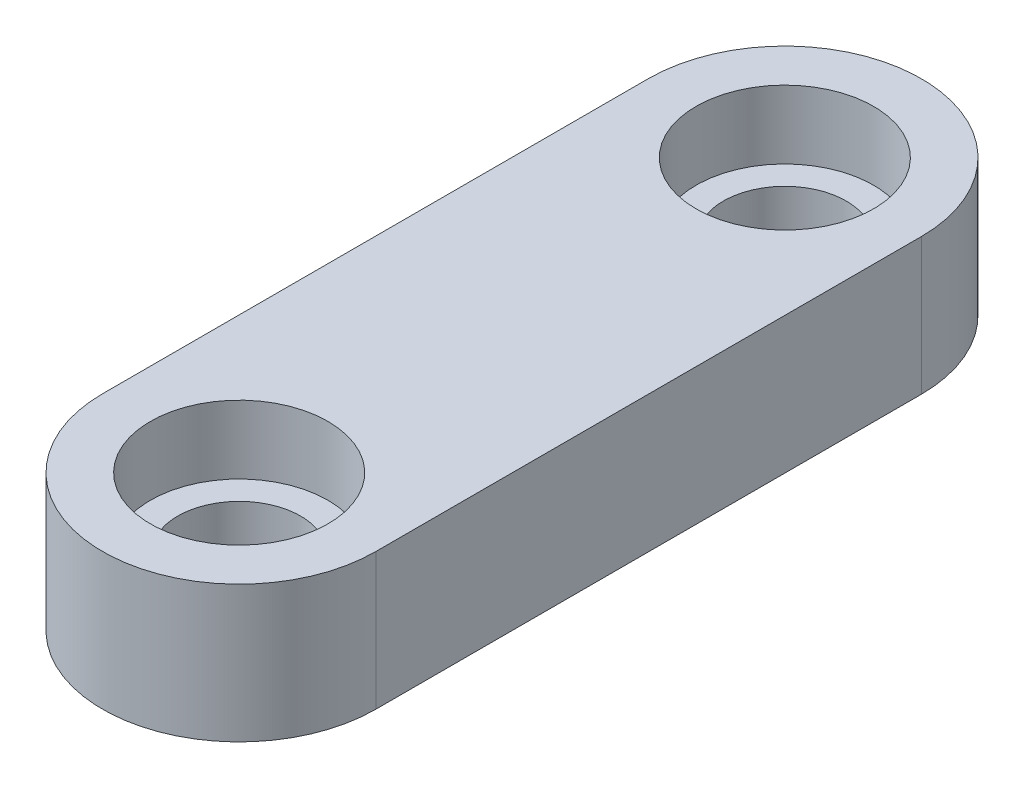
ISO-10303-21;
HEADER;
FILE_DESCRIPTION(('STEP AP214'),'2;1');
FILE_NAME('part.step','',(''),(''),'','','');
FILE_SCHEMA(('AUTOMOTIVE_DESIGN { 1 0 10303 214 1 1 1 1 }'));
ENDSEC;
DATA;
#1=APPLICATION_CONTEXT('core data for automotive mechanical design processes');
#2=APPLICATION_PROTOCOL_DEFINITION('international standard','automotive_design',2000,#1);
#3=PRODUCT_CONTEXT('',#1,'mechanical');
#4=PRODUCT('Part','Part','',(#3));
#5=PRODUCT_RELATED_PRODUCT_CATEGORY('part','',(#4));
#6=PRODUCT_DEFINITION_FORMATION('','',#4);
#7=PRODUCT_DEFINITION_CONTEXT('part definition',#1,'design');
#8=PRODUCT_DEFINITION('design','',#6,#7);
#9=PRODUCT_DEFINITION_SHAPE('','',#8);
#10=(LENGTH_UNIT() NAMED_UNIT(*) SI_UNIT(.MILLI.,.METRE.));
#11=(NAMED_UNIT(*) PLANE_ANGLE_UNIT() SI_UNIT($,.RADIAN.));
#12=(NAMED_UNIT(*) SI_UNIT($,.STERADIAN.) SOLID_ANGLE_UNIT());
#13=UNCERTAINTY_MEASURE_WITH_UNIT(LENGTH_MEASURE(1.E-05),#10,'distance_accuracy_value','');
#14=(GEOMETRIC_REPRESENTATION_CONTEXT(3) GLOBAL_UNCERTAINTY_ASSIGNED_CONTEXT((#13)) GLOBAL_UNIT_ASSIGNED_CONTEXT((#10,
#11,#12)) REPRESENTATION_CONTEXT('',''));
#15=CARTESIAN_POINT('',(0.,0.,0.));
#16=DIRECTION('',(0.,0.,1.));
#17=DIRECTION('',(1.,0.,0.));
#18=AXIS2_PLACEMENT_3D('',#15,#16,#17);
#19=CARTESIAN_POINT('',(-10.,-5.,59.9396097380543));
#20=DIRECTION('',(1.,0.,0.));
#21=DIRECTION('',(0.,0.,-1.));
#22=AXIS2_PLACEMENT_3D('',#19,#20,#21);
#23=PLANE('',#22);
#24=CARTESIAN_POINT('',(-10.,-1.,23.68932285491));
#25=DIRECTION('',(1.,0.,0.));
#26=DIRECTION('',(0.,0.,-1.));
#27=AXIS2_PLACEMENT_3D('',#24,#25,#26);
#28=CIRCLE('',#27,1.25);
#29=CARTESIAN_POINT('',(-10.,-1.,22.43932285491));
#30=VERTEX_POINT('',#29);
#31=EDGE_CURVE('E209',#30,#30,#28,.T.);
#32=ORIENTED_EDGE('',*,*,#31,.T.);
#33=EDGE_LOOP('',(#32));
#34=FACE_BOUND('',#33,.T.);
#35=CARTESIAN_POINT('',(-10.,-1.,27.8059310864469));
#36=DIRECTION('',(1.,0.,0.));
#37=DIRECTION('',(0.,0.,-1.));
#38=AXIS2_PLACEMENT_3D('',#35,#36,#37);
#39=CIRCLE('',#38,1.25);
#40=CARTESIAN_POINT('',(-10.,-1.,26.5559310864469));
#41=VERTEX_POINT('',#40);
#42=EDGE_CURVE('E530',#41,#41,#39,.T.);
#43=ORIENTED_EDGE('',*,*,#42,.T.);
#44=EDGE_LOOP('',(#43));
#45=FACE_BOUND('',#44,.T.);
#46=DIRECTION('',(0.,1.,0.));
#47=VECTOR('',#46,1.);
#48=CARTESIAN_POINT('',(-10.,-5.,49.9396097380543));
#49=LINE('',#48,#47);
#50=CARTESIAN_POINT('',(-10.,-5.,49.9396097380543));
#51=VERTEX_POINT('',#50);
#52=CARTESIAN_POINT('',(-10.,5.,49.9396097380543));
#53=VERTEX_POINT('',#52);
#54=EDGE_CURVE('E299',#51,#53,#49,.T.);
#55=ORIENTED_EDGE('',*,*,#54,.T.);
#56=DIRECTION('',(0.,0.,-1.));
#57=VECTOR('',#56,1.);
#58=CARTESIAN_POINT('',(-10.,5.,59.9396097380543));
#59=LINE('',#58,#57);
#60=CARTESIAN_POINT('',(-10.,5.,10.));
#61=VERTEX_POINT('',#60);
#62=EDGE_CURVE('E84',#53,#61,#59,.T.);
#63=ORIENTED_EDGE('',*,*,#62,.T.);
#64=DIRECTION('',(0.,1.,0.));
#65=VECTOR('',#64,1.);
#66=CARTESIAN_POINT('',(-10.,-5.,10.));
#67=LINE('',#66,#65);
#68=CARTESIAN_POINT('',(-10.,-5.,10.));
#69=VERTEX_POINT('',#68);
#70=EDGE_CURVE('E326',#69,#61,#67,.T.);
#71=ORIENTED_EDGE('',*,*,#70,.F.);
#72=DIRECTION('',(0.,0.,-1.));
#73=VECTOR('',#72,1.);
#74=CARTESIAN_POINT('',(-10.,-5.,59.9396097380543));
#75=LINE('',#74,#73);
#76=CARTESIAN_POINT('',(-10.,-5.,29.7476269706785));
#77=VERTEX_POINT('',#76);
#78=EDGE_CURVE('E349',#77,#69,#75,.T.);
#79=ORIENTED_EDGE('',*,*,#78,.F.);
#80=DIRECTION('',(0.,1.,0.));
#81=VECTOR('',#80,1.);
#82=CARTESIAN_POINT('',(-10.,-10.,29.7476269706785));
#83=LINE('',#82,#81);
#84=CARTESIAN_POINT('',(-10.,-10.,29.7476269706785));
#85=VERTEX_POINT('',#84);
#86=EDGE_CURVE('E285',#85,#77,#83,.T.);
#87=ORIENTED_EDGE('',*,*,#86,.F.);
#88=DIRECTION('',(0.,0.,1.));
#89=VECTOR('',#88,1.);
#90=CARTESIAN_POINT('',(-10.,-10.,33.7738022007449));
#91=LINE('',#90,#89);
#92=CARTESIAN_POINT('',(-10.,-10.,33.7738022007449));
#93=VERTEX_POINT('',#92);
#94=EDGE_CURVE('E237',#85,#93,#91,.T.);
#95=ORIENTED_EDGE('',*,*,#94,.T.);
#96=DIRECTION('',(0.,1.,0.));
#97=VECTOR('',#96,1.);
#98=CARTESIAN_POINT('',(-10.,-10.,33.7738022007449));
#99=LINE('',#98,#97);
#100=CARTESIAN_POINT('',(-10.,-5.,33.7738022007449));
#101=VERTEX_POINT('',#100);
#102=EDGE_CURVE('E282',#93,#101,#99,.T.);
#103=ORIENTED_EDGE('',*,*,#102,.T.);
#104=EDGE_CURVE('E350',#51,#101,#75,.T.);
#105=ORIENTED_EDGE('',*,*,#104,.F.);
#106=EDGE_LOOP('',(#55,#63,#71,#79,#87,#95,#103,#105));
#107=FACE_BOUND('',#106,.T.);
#108=ADVANCED_FACE('F74',(#34,#45,#107),#23,.F.);
#109=CARTESIAN_POINT('',(-10.,5.,59.9396097380543));
#110=DIRECTION('',(0.,-1.,0.));
#111=DIRECTION('',(0.,0.,-1.));
#112=AXIS2_PLACEMENT_3D('',#109,#110,#111);
#113=PLANE('',#112);
#114=CARTESIAN_POINT('',(0.,5.,49.9396097380543));
#115=DIRECTION('',(0.,-1.,0.));
#116=DIRECTION('',(0.,0.,-1.));
#117=AXIS2_PLACEMENT_3D('',#114,#115,#116);
#118=CIRCLE('',#117,6.5);
#119=CARTESIAN_POINT('',(0.,5.,43.4396097380543));
#120=VERTEX_POINT('',#119);
#121=EDGE_CURVE('E309',#120,#120,#118,.T.);
#122=ORIENTED_EDGE('',*,*,#121,.T.);
#123=EDGE_LOOP('',(#122));
#124=FACE_BOUND('',#123,.T.);
#125=CARTESIAN_POINT('',(0.,5.,10.));
#126=DIRECTION('',(0.,1.,0.));
#127=DIRECTION('',(0.,0.,1.));
#128=AXIS2_PLACEMENT_3D('',#125,#126,#127);
#129=CIRCLE('',#128,6.5);
#130=CARTESIAN_POINT('',(0.,5.,16.5));
#131=VERTEX_POINT('',#130);
#132=EDGE_CURVE('E338',#131,#131,#129,.T.);
#133=ORIENTED_EDGE('',*,*,#132,.F.);
#134=EDGE_LOOP('',(#133));
#135=FACE_BOUND('',#134,.T.);
#136=CARTESIAN_POINT('',(0.,5.,49.9396097380543));
#137=DIRECTION('',(0.,-1.,0.));
#138=DIRECTION('',(0.,0.,-1.));
#139=AXIS2_PLACEMENT_3D('',#136,#137,#138);
#140=CIRCLE('',#139,10.);
#141=CARTESIAN_POINT('',(10.,5.,49.9396097380543));
#142=VERTEX_POINT('',#141);
#143=EDGE_CURVE('E294',#142,#53,#140,.T.);
#144=ORIENTED_EDGE('',*,*,#143,.F.);
#145=DIRECTION('',(0.,0.,-1.));
#146=VECTOR('',#145,1.);
#147=CARTESIAN_POINT('',(10.,5.,59.9396097380543));
#148=LINE('',#147,#146);
#149=CARTESIAN_POINT('',(10.,5.,10.));
#150=VERTEX_POINT('',#149);
#151=EDGE_CURVE('E12',#142,#150,#148,.T.);
#152=ORIENTED_EDGE('',*,*,#151,.T.);
#153=CARTESIAN_POINT('',(0.,5.,10.));
#154=DIRECTION('',(0.,1.,0.));
#155=DIRECTION('',(0.,0.,1.));
#156=AXIS2_PLACEMENT_3D('',#153,#154,#155);
#157=CIRCLE('',#156,10.);
#158=EDGE_CURVE('E321',#150,#61,#157,.T.);
#159=ORIENTED_EDGE('',*,*,#158,.T.);
#160=ORIENTED_EDGE('',*,*,#62,.F.);
#161=EDGE_LOOP('',(#144,#152,#159,#160));
#162=FACE_BOUND('',#161,.T.);
#163=ADVANCED_FACE('F374',(#124,#135,#162),#113,.F.);
#164=CARTESIAN_POINT('',(-10.,-5.,59.9396097380543));
#165=DIRECTION('',(0.,1.,0.));
#166=DIRECTION('',(0.,0.,1.));
#167=AXIS2_PLACEMENT_3D('',#164,#165,#166);
#168=PLANE('',#167);
#169=CARTESIAN_POINT('',(0.,-5.,49.9396097380543));
#170=DIRECTION('',(0.,1.,0.));
#171=DIRECTION('',(0.,0.,1.));
#172=AXIS2_PLACEMENT_3D('',#169,#170,#171);
#173=CIRCLE('',#172,4.5);
#174=CARTESIAN_POINT('',(0.,-5.,54.4396097380543));
#175=VERTEX_POINT('',#174);
#176=EDGE_CURVE('E305',#175,#175,#173,.F.);
#177=ORIENTED_EDGE('',*,*,#176,.F.);
#178=EDGE_LOOP('',(#177));
#179=FACE_BOUND('',#178,.T.);
#180=CARTESIAN_POINT('',(0.,-5.,10.));
#181=DIRECTION('',(0.,1.,0.));
#182=DIRECTION('',(0.,0.,1.));
#183=AXIS2_PLACEMENT_3D('',#180,#181,#182);
#184=CIRCLE('',#183,4.5);
#185=CARTESIAN_POINT('',(0.,-5.,14.5));
#186=VERTEX_POINT('',#185);
#187=EDGE_CURVE('E334',#186,#186,#184,.T.);
#188=ORIENTED_EDGE('',*,*,#187,.T.);
#189=EDGE_LOOP('',(#188));
#190=FACE_BOUND('',#189,.T.);
#191=DIRECTION('',(1.,0.,0.));
#192=VECTOR('',#191,1.);
#193=CARTESIAN_POINT('',(-7.,-5.,21.7476269706784));
#194=LINE('',#193,#192);
#195=CARTESIAN_POINT('',(-7.,-5.,21.7476269706784));
#196=VERTEX_POINT('',#195);
#197=CARTESIAN_POINT('',(-3.8915716590061,-5.,21.7476269706784));
#198=VERTEX_POINT('',#197);
#199=EDGE_CURVE('E206',#196,#198,#194,.T.);
#200=ORIENTED_EDGE('',*,*,#199,.F.);
#201=DIRECTION('',(0.,0.,-1.));
#202=VECTOR('',#201,1.);
#203=CARTESIAN_POINT('',(-7.,-5.,29.7476269706784));
#204=LINE('',#203,#202);
#205=CARTESIAN_POINT('',(-7.,-5.,29.7476269706784));
#206=VERTEX_POINT('',#205);
#207=EDGE_CURVE('E184',#206,#196,#204,.T.);
#208=ORIENTED_EDGE('',*,*,#207,.F.);
#209=DIRECTION('',(-1.,0.,0.));
#210=VECTOR('',#209,1.);
#211=CARTESIAN_POINT('',(0.,-5.,29.7476269706784));
#212=LINE('',#211,#210);
#213=EDGE_CURVE('E256',#206,#77,#212,.T.);
#214=ORIENTED_EDGE('',*,*,#213,.T.);
#215=ORIENTED_EDGE('',*,*,#78,.T.);
#216=CARTESIAN_POINT('',(0.,-5.,10.));
#217=DIRECTION('',(0.,1.,0.));
#218=DIRECTION('',(0.,0.,1.));
#219=AXIS2_PLACEMENT_3D('',#216,#217,#218);
#220=CIRCLE('',#219,10.);
#221=CARTESIAN_POINT('',(10.,-5.,10.));
#222=VERTEX_POINT('',#221);
#223=EDGE_CURVE('E322',#222,#69,#220,.T.);
#224=ORIENTED_EDGE('',*,*,#223,.F.);
#225=DIRECTION('',(0.,0.,-1.));
#226=VECTOR('',#225,1.);
#227=CARTESIAN_POINT('',(10.,-5.,59.9396097380543));
#228=LINE('',#227,#226);
#229=CARTESIAN_POINT('',(10.,-5.,49.9396097380543));
#230=VERTEX_POINT('',#229);
#231=EDGE_CURVE('E343',#230,#222,#228,.T.);
#232=ORIENTED_EDGE('',*,*,#231,.F.);
#233=CARTESIAN_POINT('',(0.,-5.,49.9396097380543));
#234=DIRECTION('',(0.,-1.,0.));
#235=DIRECTION('',(0.,0.,-1.));
#236=AXIS2_PLACEMENT_3D('',#233,#234,#235);
#237=CIRCLE('',#236,10.);
#238=EDGE_CURVE('E295',#230,#51,#237,.T.);
#239=ORIENTED_EDGE('',*,*,#238,.T.);
#240=ORIENTED_EDGE('',*,*,#104,.T.);
#241=DIRECTION('',(0.86602540378444,0.,0.499999999999998));
#242=VECTOR('',#241,1.);
#243=CARTESIAN_POINT('',(-3.74463441831306,-5.,37.3853392032113));
#244=LINE('',#243,#242);
#245=CARTESIAN_POINT('',(-3.74463441831306,-5.,37.3853392032113));
#246=VERTEX_POINT('',#245);
#247=EDGE_CURVE('E261',#101,#246,#244,.T.);
#248=ORIENTED_EDGE('',*,*,#247,.T.);
#249=DIRECTION('',(0.,0.,-1.));
#250=VECTOR('',#249,1.);
#251=CARTESIAN_POINT('',(-3.74463441831294,-5.,33.8403871371327));
#252=LINE('',#251,#250);
#253=CARTESIAN_POINT('',(-3.74463441831294,-5.,33.8403871371327));
#254=VERTEX_POINT('',#253);
#255=EDGE_CURVE('E265',#246,#254,#252,.T.);
#256=ORIENTED_EDGE('',*,*,#255,.T.);
#257=DIRECTION('',(1.,0.,0.));
#258=VECTOR('',#257,1.);
#259=CARTESIAN_POINT('',(-3.74463441831294,-5.,33.8403871371327));
#260=LINE('',#259,#258);
#261=CARTESIAN_POINT('',(0.,-5.,33.8403871371327));
#262=VERTEX_POINT('',#261);
#263=EDGE_CURVE('E233',#254,#262,#260,.T.);
#264=ORIENTED_EDGE('',*,*,#263,.T.);
#265=DIRECTION('',(0.,0.,-1.));
#266=VECTOR('',#265,1.);
#267=CARTESIAN_POINT('',(0.,-5.,29.7476269706784));
#268=LINE('',#267,#266);
#269=CARTESIAN_POINT('',(0.,-5.,29.7476269706784));
#270=VERTEX_POINT('',#269);
#271=EDGE_CURVE('E100',#262,#270,#268,.T.);
#272=ORIENTED_EDGE('',*,*,#271,.T.);
#273=CARTESIAN_POINT('',(-3.8915716590061,-5.,29.7476269706784));
#274=VERTEX_POINT('',#273);
#275=EDGE_CURVE('E257',#270,#274,#212,.T.);
#276=ORIENTED_EDGE('',*,*,#275,.T.);
#277=DIRECTION('',(0.,0.,1.));
#278=VECTOR('',#277,1.);
#279=CARTESIAN_POINT('',(-3.8915716590061,-5.,29.7476269706784));
#280=LINE('',#279,#278);
#281=EDGE_CURVE('E92',#198,#274,#280,.T.);
#282=ORIENTED_EDGE('',*,*,#281,.F.);
#283=EDGE_LOOP('',(#200,#208,#214,#215,#224,#232,#239,#240,#248,#256,#264,#272,#276,#282));
#284=FACE_BOUND('',#283,.T.);
#285=ADVANCED_FACE('F377',(#179,#190,#284),#168,.F.);
#286=CARTESIAN_POINT('',(10.,-5.,59.9396097380543));
#287=DIRECTION('',(-1.,0.,0.));
#288=DIRECTION('',(0.,0.,1.));
#289=AXIS2_PLACEMENT_3D('',#286,#287,#288);
#290=PLANE('',#289);
#291=ORIENTED_EDGE('',*,*,#151,.F.);
#292=DIRECTION('',(0.,1.,0.));
#293=VECTOR('',#292,1.);
#294=CARTESIAN_POINT('',(10.,-5.,49.9396097380543));
#295=LINE('',#294,#293);
#296=EDGE_CURVE('E275',#230,#142,#295,.T.);
#297=ORIENTED_EDGE('',*,*,#296,.F.);
#298=ORIENTED_EDGE('',*,*,#231,.T.);
#299=DIRECTION('',(0.,1.,0.));
#300=VECTOR('',#299,1.);
#301=CARTESIAN_POINT('',(10.,-5.,10.));
#302=LINE('',#301,#300);
#303=EDGE_CURVE('E314',#222,#150,#302,.T.);
#304=ORIENTED_EDGE('',*,*,#303,.T.);
#305=EDGE_LOOP('',(#291,#297,#298,#304));
#306=FACE_BOUND('',#305,.T.);
#307=ADVANCED_FACE('F76',(#306),#290,.F.);
#308=CARTESIAN_POINT('',(0.,0.,10.));
#309=DIRECTION('',(0.,1.,0.));
#310=DIRECTION('',(0.,0.,1.));
#311=AXIS2_PLACEMENT_3D('',#308,#309,#310);
#312=CYLINDRICAL_SURFACE('',#311,6.5);
#313=CARTESIAN_POINT('',(0.,0.,10.));
#314=DIRECTION('',(0.,1.,0.));
#315=DIRECTION('',(0.,0.,1.));
#316=AXIS2_PLACEMENT_3D('',#313,#314,#315);
#317=CIRCLE('',#316,6.5);
#318=CARTESIAN_POINT('',(0.,0.,16.5));
#319=VERTEX_POINT('',#318);
#320=EDGE_CURVE('E339',#319,#319,#317,.T.);
#321=ORIENTED_EDGE('',*,*,#320,.F.);
#322=EDGE_LOOP('',(#321));
#323=FACE_BOUND('',#322,.T.);
#324=ORIENTED_EDGE('',*,*,#132,.T.);
#325=EDGE_LOOP('',(#324));
#326=FACE_BOUND('',#325,.T.);
#327=ADVANCED_FACE('F365',(#323,#326),#312,.F.);
#328=CARTESIAN_POINT('',(0.,0.,10.));
#329=DIRECTION('',(0.,1.,0.));
#330=DIRECTION('',(0.,0.,1.));
#331=AXIS2_PLACEMENT_3D('',#328,#329,#330);
#332=PLANE('',#331);
#333=CARTESIAN_POINT('',(0.,0.,10.));
#334=DIRECTION('',(0.,1.,0.));
#335=DIRECTION('',(0.,0.,1.));
#336=AXIS2_PLACEMENT_3D('',#333,#334,#335);
#337=CIRCLE('',#336,4.5);
#338=CARTESIAN_POINT('',(0.,0.,14.5));
#339=VERTEX_POINT('',#338);
#340=EDGE_CURVE('E333',#339,#339,#337,.T.);
#341=ORIENTED_EDGE('',*,*,#340,.F.);
#342=EDGE_LOOP('',(#341));
#343=FACE_BOUND('',#342,.T.);
#344=ORIENTED_EDGE('',*,*,#320,.T.);
#345=EDGE_LOOP('',(#344));
#346=FACE_BOUND('',#345,.T.);
#347=ADVANCED_FACE('F362',(#343,#346),#332,.T.);
#348=CARTESIAN_POINT('',(0.,-15.,10.));
#349=DIRECTION('',(0.,1.,0.));
#350=DIRECTION('',(0.,0.,1.));
#351=AXIS2_PLACEMENT_3D('',#348,#349,#350);
#352=CYLINDRICAL_SURFACE('',#351,4.5);
#353=ORIENTED_EDGE('',*,*,#340,.T.);
#354=EDGE_LOOP('',(#353));
#355=FACE_BOUND('',#354,.T.);
#356=ORIENTED_EDGE('',*,*,#187,.F.);
#357=EDGE_LOOP('',(#356));
#358=FACE_BOUND('',#357,.T.);
#359=ADVANCED_FACE('F359',(#355,#358),#352,.F.);
#360=CARTESIAN_POINT('',(0.,-5.,10.));
#361=DIRECTION('',(0.,1.,0.));
#362=DIRECTION('',(0.,0.,1.));
#363=AXIS2_PLACEMENT_3D('',#360,#361,#362);
#364=CYLINDRICAL_SURFACE('',#363,10.);
#365=ORIENTED_EDGE('',*,*,#158,.F.);
#366=ORIENTED_EDGE('',*,*,#303,.F.);
#367=ORIENTED_EDGE('',*,*,#223,.T.);
#368=ORIENTED_EDGE('',*,*,#70,.T.);
#369=EDGE_LOOP('',(#365,#366,#367,#368));
#370=FACE_BOUND('',#369,.T.);
#371=ADVANCED_FACE('F390',(#370),#364,.T.);
#372=CARTESIAN_POINT('',(0.,0.,49.9396097380543));
#373=DIRECTION('',(0.,1.,0.));
#374=DIRECTION('',(0.,0.,1.));
#375=AXIS2_PLACEMENT_3D('',#372,#373,#374);
#376=CYLINDRICAL_SURFACE('',#375,6.5);
#377=CARTESIAN_POINT('',(0.,0.,49.9396097380543));
#378=DIRECTION('',(0.,-1.,0.));
#379=DIRECTION('',(0.,0.,-1.));
#380=AXIS2_PLACEMENT_3D('',#377,#378,#379);
#381=CIRCLE('',#380,6.5);
#382=CARTESIAN_POINT('',(0.,0.,43.4396097380543));
#383=VERTEX_POINT('',#382);
#384=EDGE_CURVE('E310',#383,#383,#381,.T.);
#385=ORIENTED_EDGE('',*,*,#384,.T.);
#386=EDGE_LOOP('',(#385));
#387=FACE_BOUND('',#386,.T.);
#388=ORIENTED_EDGE('',*,*,#121,.F.);
#389=EDGE_LOOP('',(#388));
#390=FACE_BOUND('',#389,.T.);
#391=ADVANCED_FACE('F448',(#387,#390),#376,.F.);
#392=CARTESIAN_POINT('',(0.,0.,49.9396097380543));
#393=DIRECTION('',(0.,1.,0.));
#394=DIRECTION('',(0.,0.,-1.));
#395=AXIS2_PLACEMENT_3D('',#392,#393,#394);
#396=PLANE('',#395);
#397=CARTESIAN_POINT('',(0.,0.,49.9396097380543));
#398=DIRECTION('',(0.,1.,0.));
#399=DIRECTION('',(0.,0.,1.));
#400=AXIS2_PLACEMENT_3D('',#397,#398,#399);
#401=CIRCLE('',#400,4.5);
#402=CARTESIAN_POINT('',(0.,0.,54.4396097380543));
#403=VERTEX_POINT('',#402);
#404=EDGE_CURVE('E78',#403,#403,#401,.F.);
#405=ORIENTED_EDGE('',*,*,#404,.T.);
#406=EDGE_LOOP('',(#405));
#407=FACE_BOUND('',#406,.T.);
#408=ORIENTED_EDGE('',*,*,#384,.F.);
#409=EDGE_LOOP('',(#408));
#410=FACE_BOUND('',#409,.T.);
#411=ADVANCED_FACE('F451',(#407,#410),#396,.T.);
#412=CARTESIAN_POINT('',(0.,-15.,49.9396097380543));
#413=DIRECTION('',(0.,1.,0.));
#414=DIRECTION('',(0.,0.,1.));
#415=AXIS2_PLACEMENT_3D('',#412,#413,#414);
#416=CYLINDRICAL_SURFACE('',#415,4.5);
#417=ORIENTED_EDGE('',*,*,#404,.F.);
#418=EDGE_LOOP('',(#417));
#419=FACE_BOUND('',#418,.T.);
#420=ORIENTED_EDGE('',*,*,#176,.T.);
#421=EDGE_LOOP('',(#420));
#422=FACE_BOUND('',#421,.T.);
#423=ADVANCED_FACE('F455',(#419,#422),#416,.F.);
#424=CARTESIAN_POINT('',(0.,-5.,49.9396097380543));
#425=DIRECTION('',(0.,1.,0.));
#426=DIRECTION('',(0.,0.,1.));
#427=AXIS2_PLACEMENT_3D('',#424,#425,#426);
#428=CYLINDRICAL_SURFACE('',#427,10.);
#429=ORIENTED_EDGE('',*,*,#143,.T.);
#430=ORIENTED_EDGE('',*,*,#54,.F.);
#431=ORIENTED_EDGE('',*,*,#238,.F.);
#432=ORIENTED_EDGE('',*,*,#296,.T.);
#433=EDGE_LOOP('',(#429,#430,#431,#432));
#434=FACE_BOUND('',#433,.T.);
#435=ADVANCED_FACE('F384',(#434),#428,.T.);
#436=CARTESIAN_POINT('',(0.,-10.,29.7476269706784));
#437=DIRECTION('',(1.,0.,0.));
#438=DIRECTION('',(0.,0.,-1.));
#439=AXIS2_PLACEMENT_3D('',#436,#437,#438);
#440=PLANE('',#439);
#441=ORIENTED_EDGE('',*,*,#271,.F.);
#442=DIRECTION('',(0.,1.,0.));
#443=VECTOR('',#442,1.);
#444=CARTESIAN_POINT('',(0.,-10.,33.8403871371327));
#445=LINE('',#444,#443);
#446=CARTESIAN_POINT('',(0.,-10.,33.8403871371327));
#447=VERTEX_POINT('',#446);
#448=EDGE_CURVE('E272',#447,#262,#445,.T.);
#449=ORIENTED_EDGE('',*,*,#448,.F.);
#450=DIRECTION('',(0.,0.,-1.));
#451=VECTOR('',#450,1.);
#452=CARTESIAN_POINT('',(0.,-10.,29.7476269706784));
#453=LINE('',#452,#451);
#454=CARTESIAN_POINT('',(0.,-10.,29.7476269706784));
#455=VERTEX_POINT('',#454);
#456=EDGE_CURVE('E228',#447,#455,#453,.T.);
#457=ORIENTED_EDGE('',*,*,#456,.T.);
#458=DIRECTION('',(0.,1.,0.));
#459=VECTOR('',#458,1.);
#460=CARTESIAN_POINT('',(0.,-10.,29.7476269706784));
#461=LINE('',#460,#459);
#462=EDGE_CURVE('E253',#455,#270,#461,.T.);
#463=ORIENTED_EDGE('',*,*,#462,.T.);
#464=EDGE_LOOP('',(#441,#449,#457,#463));
#465=FACE_BOUND('',#464,.T.);
#466=ADVANCED_FACE('F419',(#465),#440,.T.);
#467=CARTESIAN_POINT('',(-3.74463441831294,-10.,33.8403871371327));
#468=DIRECTION('',(0.,0.,1.));
#469=DIRECTION('',(1.,0.,0.));
#470=AXIS2_PLACEMENT_3D('',#467,#468,#469);
#471=PLANE('',#470);
#472=ORIENTED_EDGE('',*,*,#263,.F.);
#473=DIRECTION('',(0.,1.,0.));
#474=VECTOR('',#473,1.);
#475=CARTESIAN_POINT('',(-3.74463441831294,-10.,33.8403871371327));
#476=LINE('',#475,#474);
#477=CARTESIAN_POINT('',(-3.74463441831294,-10.,33.8403871371327));
#478=VERTEX_POINT('',#477);
#479=EDGE_CURVE('E276',#478,#254,#476,.T.);
#480=ORIENTED_EDGE('',*,*,#479,.F.);
#481=DIRECTION('',(1.,0.,0.));
#482=VECTOR('',#481,1.);
#483=CARTESIAN_POINT('',(-3.74463441831294,-10.,33.8403871371327));
#484=LINE('',#483,#482);
#485=EDGE_CURVE('E249',#478,#447,#484,.T.);
#486=ORIENTED_EDGE('',*,*,#485,.T.);
#487=ORIENTED_EDGE('',*,*,#448,.T.);
#488=EDGE_LOOP('',(#472,#480,#486,#487));
#489=FACE_BOUND('',#488,.T.);
#490=ADVANCED_FACE('F418',(#489),#471,.T.);
#491=CARTESIAN_POINT('',(-3.74463441831294,-10.,33.8403871371327));
#492=DIRECTION('',(1.,0.,0.));
#493=DIRECTION('',(0.,0.,-1.));
#494=AXIS2_PLACEMENT_3D('',#491,#492,#493);
#495=PLANE('',#494);
#496=ORIENTED_EDGE('',*,*,#255,.F.);
#497=DIRECTION('',(0.,1.,0.));
#498=VECTOR('',#497,1.);
#499=CARTESIAN_POINT('',(-3.74463441831306,-10.,37.3853392032113));
#500=LINE('',#499,#498);
#501=CARTESIAN_POINT('',(-3.74463441831306,-10.,37.3853392032113));
#502=VERTEX_POINT('',#501);
#503=EDGE_CURVE('E279',#502,#246,#500,.T.);
#504=ORIENTED_EDGE('',*,*,#503,.F.);
#505=DIRECTION('',(0.,0.,-1.));
#506=VECTOR('',#505,1.);
#507=CARTESIAN_POINT('',(-3.74463441831294,-10.,33.8403871371327));
#508=LINE('',#507,#506);
#509=EDGE_CURVE('E245',#502,#478,#508,.T.);
#510=ORIENTED_EDGE('',*,*,#509,.T.);
#511=ORIENTED_EDGE('',*,*,#479,.T.);
#512=EDGE_LOOP('',(#496,#504,#510,#511));
#513=FACE_BOUND('',#512,.T.);
#514=ADVANCED_FACE('F416',(#513),#495,.T.);
#515=CARTESIAN_POINT('',(-3.74463441831306,-10.,37.3853392032113));
#516=DIRECTION('',(-0.499999999999998,0.,0.86602540378444));
#517=DIRECTION('',(0.86602540378444,0.,0.499999999999998));
#518=AXIS2_PLACEMENT_3D('',#515,#516,#517);
#519=PLANE('',#518);
#520=ORIENTED_EDGE('',*,*,#247,.F.);
#521=ORIENTED_EDGE('',*,*,#102,.F.);
#522=DIRECTION('',(0.86602540378444,0.,0.499999999999998));
#523=VECTOR('',#522,1.);
#524=CARTESIAN_POINT('',(-3.74463441831306,-10.,37.3853392032113));
#525=LINE('',#524,#523);
#526=EDGE_CURVE('E241',#93,#502,#525,.T.);
#527=ORIENTED_EDGE('',*,*,#526,.T.);
#528=ORIENTED_EDGE('',*,*,#503,.T.);
#529=EDGE_LOOP('',(#520,#521,#527,#528));
#530=FACE_BOUND('',#529,.T.);
#531=ADVANCED_FACE('F412',(#530),#519,.T.);
#532=CARTESIAN_POINT('',(0.,-10.,29.7476269706784));
#533=DIRECTION('',(0.,0.,-1.));
#534=DIRECTION('',(-1.,0.,0.));
#535=AXIS2_PLACEMENT_3D('',#532,#533,#534);
#536=PLANE('',#535);
#537=ORIENTED_EDGE('',*,*,#275,.F.);
#538=ORIENTED_EDGE('',*,*,#462,.F.);
#539=DIRECTION('',(-1.,0.,0.));
#540=VECTOR('',#539,1.);
#541=CARTESIAN_POINT('',(0.,-10.,29.7476269706784));
#542=LINE('',#541,#540);
#543=EDGE_CURVE('E232',#455,#85,#542,.T.);
#544=ORIENTED_EDGE('',*,*,#543,.T.);
#545=ORIENTED_EDGE('',*,*,#86,.T.);
#546=ORIENTED_EDGE('',*,*,#213,.F.);
#547=DIRECTION('',(0.,-1.,0.));
#548=VECTOR('',#547,1.);
#549=CARTESIAN_POINT('',(-7.,3.,29.7476269706784));
#550=LINE('',#549,#548);
#551=CARTESIAN_POINT('',(-7.,3.,29.7476269706784));
#552=VERTEX_POINT('',#551);
#553=EDGE_CURVE('E220',#552,#206,#550,.T.);
#554=ORIENTED_EDGE('',*,*,#553,.F.);
#555=DIRECTION('',(-1.,0.,0.));
#556=VECTOR('',#555,1.);
#557=CARTESIAN_POINT('',(-7.,3.,29.7476269706784));
#558=LINE('',#557,#556);
#559=CARTESIAN_POINT('',(-3.8915716590061,3.,29.7476269706784));
#560=VERTEX_POINT('',#559);
#561=EDGE_CURVE('E190',#560,#552,#558,.T.);
#562=ORIENTED_EDGE('',*,*,#561,.F.);
#563=DIRECTION('',(0.,-1.,0.));
#564=VECTOR('',#563,1.);
#565=CARTESIAN_POINT('',(-3.8915716590061,3.,29.7476269706784));
#566=LINE('',#565,#564);
#567=EDGE_CURVE('E223',#560,#274,#566,.T.);
#568=ORIENTED_EDGE('',*,*,#567,.T.);
#569=EDGE_LOOP('',(#537,#538,#544,#545,#546,#554,#562,#568));
#570=FACE_BOUND('',#569,.T.);
#571=ADVANCED_FACE('F401',(#570),#536,.T.);
#572=CARTESIAN_POINT('',(0.,-10.,0.));
#573=DIRECTION('',(0.,1.,0.));
#574=DIRECTION('',(0.,0.,1.));
#575=AXIS2_PLACEMENT_3D('',#572,#573,#574);
#576=PLANE('',#575);
#577=ORIENTED_EDGE('',*,*,#456,.F.);
#578=ORIENTED_EDGE('',*,*,#485,.F.);
#579=ORIENTED_EDGE('',*,*,#509,.F.);
#580=ORIENTED_EDGE('',*,*,#526,.F.);
#581=ORIENTED_EDGE('',*,*,#94,.F.);
#582=ORIENTED_EDGE('',*,*,#543,.F.);
#583=EDGE_LOOP('',(#577,#578,#579,#580,#581,#582));
#584=FACE_BOUND('',#583,.T.);
#585=ADVANCED_FACE('F407',(#584),#576,.F.);
#586=CARTESIAN_POINT('',(-7.,3.,29.7476269706784));
#587=DIRECTION('',(-1.,0.,0.));
#588=DIRECTION('',(0.,0.,1.));
#589=AXIS2_PLACEMENT_3D('',#586,#587,#588);
#590=PLANE('',#589);
#591=CARTESIAN_POINT('',(-7.,-1.,23.68932285491));
#592=DIRECTION('',(1.,0.,0.));
#593=DIRECTION('',(0.,0.,-1.));
#594=AXIS2_PLACEMENT_3D('',#591,#592,#593);
#595=CIRCLE('',#594,1.25);
#596=CARTESIAN_POINT('',(-7.,-1.,22.43932285491));
#597=VERTEX_POINT('',#596);
#598=EDGE_CURVE('E527',#597,#597,#595,.T.);
#599=ORIENTED_EDGE('',*,*,#598,.F.);
#600=EDGE_LOOP('',(#599));
#601=FACE_BOUND('',#600,.T.);
#602=CARTESIAN_POINT('',(-7.,-1.,27.8059310864469));
#603=DIRECTION('',(1.,0.,0.));
#604=DIRECTION('',(0.,0.,1.));
#605=AXIS2_PLACEMENT_3D('',#602,#603,#604);
#606=CIRCLE('',#605,1.25);
#607=CARTESIAN_POINT('',(-7.,-1.,29.0559310864469));
#608=VERTEX_POINT('',#607);
#609=EDGE_CURVE('E535',#608,#608,#606,.T.);
#610=ORIENTED_EDGE('',*,*,#609,.F.);
#611=EDGE_LOOP('',(#610));
#612=FACE_BOUND('',#611,.T.);
#613=ORIENTED_EDGE('',*,*,#207,.T.);
#614=DIRECTION('',(0.,-1.,0.));
#615=VECTOR('',#614,1.);
#616=CARTESIAN_POINT('',(-7.,3.,21.7476269706784));
#617=LINE('',#616,#615);
#618=CARTESIAN_POINT('',(-7.,3.,21.7476269706784));
#619=VERTEX_POINT('',#618);
#620=EDGE_CURVE('E177',#619,#196,#617,.T.);
#621=ORIENTED_EDGE('',*,*,#620,.F.);
#622=DIRECTION('',(0.,0.,-1.));
#623=VECTOR('',#622,1.);
#624=CARTESIAN_POINT('',(-7.,3.,29.7476269706784));
#625=LINE('',#624,#623);
#626=EDGE_CURVE('E181',#552,#619,#625,.T.);
#627=ORIENTED_EDGE('',*,*,#626,.F.);
#628=ORIENTED_EDGE('',*,*,#553,.T.);
#629=EDGE_LOOP('',(#613,#621,#627,#628));
#630=FACE_BOUND('',#629,.T.);
#631=ADVANCED_FACE('F179',(#601,#612,#630),#590,.F.);
#632=CARTESIAN_POINT('',(-3.8915716590061,3.,29.7476269706784));
#633=DIRECTION('',(1.,0.,0.));
#634=DIRECTION('',(0.,0.,-1.));
#635=AXIS2_PLACEMENT_3D('',#632,#633,#634);
#636=PLANE('',#635);
#637=ORIENTED_EDGE('',*,*,#281,.T.);
#638=ORIENTED_EDGE('',*,*,#567,.F.);
#639=DIRECTION('',(0.,0.,1.));
#640=VECTOR('',#639,1.);
#641=CARTESIAN_POINT('',(-3.8915716590061,3.,29.7476269706784));
#642=LINE('',#641,#640);
#643=CARTESIAN_POINT('',(-3.8915716590061,3.,21.7476269706784));
#644=VERTEX_POINT('',#643);
#645=EDGE_CURVE('E199',#644,#560,#642,.T.);
#646=ORIENTED_EDGE('',*,*,#645,.F.);
#647=DIRECTION('',(0.,-1.,0.));
#648=VECTOR('',#647,1.);
#649=CARTESIAN_POINT('',(-3.8915716590061,3.,21.7476269706784));
#650=LINE('',#649,#648);
#651=EDGE_CURVE('E189',#644,#198,#650,.T.);
#652=ORIENTED_EDGE('',*,*,#651,.T.);
#653=EDGE_LOOP('',(#637,#638,#646,#652));
#654=FACE_BOUND('',#653,.T.);
#655=ADVANCED_FACE('F420',(#654),#636,.F.);
#656=CARTESIAN_POINT('',(-7.,3.,21.7476269706784));
#657=DIRECTION('',(0.,0.,-1.));
#658=DIRECTION('',(-1.,0.,0.));
#659=AXIS2_PLACEMENT_3D('',#656,#657,#658);
#660=PLANE('',#659);
#661=ORIENTED_EDGE('',*,*,#199,.T.);
#662=ORIENTED_EDGE('',*,*,#651,.F.);
#663=DIRECTION('',(1.,0.,0.));
#664=VECTOR('',#663,1.);
#665=CARTESIAN_POINT('',(-7.,3.,21.7476269706784));
#666=LINE('',#665,#664);
#667=EDGE_CURVE('E193',#619,#644,#666,.T.);
#668=ORIENTED_EDGE('',*,*,#667,.F.);
#669=ORIENTED_EDGE('',*,*,#620,.T.);
#670=EDGE_LOOP('',(#661,#662,#668,#669));
#671=FACE_BOUND('',#670,.T.);
#672=ADVANCED_FACE('F194',(#671),#660,.F.);
#673=CARTESIAN_POINT('',(0.,3.,0.));
#674=DIRECTION('',(0.,-1.,0.));
#675=DIRECTION('',(0.,0.,-1.));
#676=AXIS2_PLACEMENT_3D('',#673,#674,#675);
#677=PLANE('',#676);
#678=ORIENTED_EDGE('',*,*,#626,.T.);
#679=ORIENTED_EDGE('',*,*,#667,.T.);
#680=ORIENTED_EDGE('',*,*,#645,.T.);
#681=ORIENTED_EDGE('',*,*,#561,.T.);
#682=EDGE_LOOP('',(#678,#679,#680,#681));
#683=FACE_BOUND('',#682,.T.);
#684=ADVANCED_FACE('F201',(#683),#677,.T.);
#685=CARTESIAN_POINT('',(-15.,-1.,27.8059310864469));
#686=DIRECTION('',(1.,0.,0.));
#687=DIRECTION('',(0.,0.,-1.));
#688=AXIS2_PLACEMENT_3D('',#685,#686,#687);
#689=CYLINDRICAL_SURFACE('',#688,1.25);
#690=ORIENTED_EDGE('',*,*,#609,.T.);
#691=EDGE_LOOP('',(#690));
#692=FACE_BOUND('',#691,.T.);
#693=ORIENTED_EDGE('',*,*,#42,.F.);
#694=EDGE_LOOP('',(#693));
#695=FACE_BOUND('',#694,.T.);
#696=ADVANCED_FACE('F490',(#692,#695),#689,.F.);
#697=CARTESIAN_POINT('',(-15.,-1.,23.68932285491));
#698=DIRECTION('',(1.,0.,0.));
#699=DIRECTION('',(0.,0.,-1.));
#700=AXIS2_PLACEMENT_3D('',#697,#698,#699);
#701=CYLINDRICAL_SURFACE('',#700,1.25);
#702=ORIENTED_EDGE('',*,*,#598,.T.);
#703=EDGE_LOOP('',(#702));
#704=FACE_BOUND('',#703,.T.);
#705=ORIENTED_EDGE('',*,*,#31,.F.);
#706=EDGE_LOOP('',(#705));
#707=FACE_BOUND('',#706,.T.);
#708=ADVANCED_FACE('F495',(#704,#707),#701,.F.);
#709=CLOSED_SHELL('',(#108,#163,#285,#307,#327,#347,#359,#371,#391,#411,#423,#435,#466,#490,
#514,#531,#571,#585,#631,#655,#672,#684,#696,#708));
#710=MANIFOLD_SOLID_BREP('B2',#709);
#711=ADVANCED_BREP_SHAPE_REPRESENTATION('',(#18,#710),#14);
#712=SHAPE_DEFINITION_REPRESENTATION(#9,#711);
ENDSEC;
END-ISO-10303-21;
